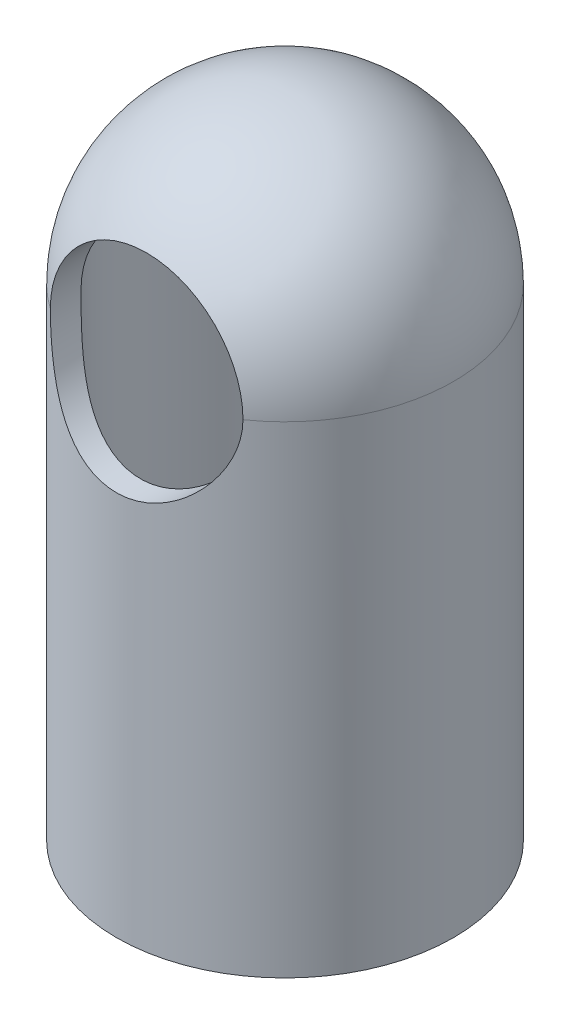
ISO-10303-21;
HEADER;
FILE_DESCRIPTION(('STEP AP214'),'2;1');
FILE_NAME('part.step','',(''),(''),'','','');
FILE_SCHEMA(('AUTOMOTIVE_DESIGN { 1 0 10303 214 1 1 1 1 }'));
ENDSEC;
DATA;
#1=APPLICATION_CONTEXT('core data for automotive mechanical design processes');
#2=APPLICATION_PROTOCOL_DEFINITION('international standard','automotive_design',2000,#1);
#3=PRODUCT_CONTEXT('',#1,'mechanical');
#4=PRODUCT('Part','Part','',(#3));
#5=PRODUCT_RELATED_PRODUCT_CATEGORY('part','',(#4));
#6=PRODUCT_DEFINITION_FORMATION('','',#4);
#7=PRODUCT_DEFINITION_CONTEXT('part definition',#1,'design');
#8=PRODUCT_DEFINITION('design','',#6,#7);
#9=PRODUCT_DEFINITION_SHAPE('','',#8);
#10=(LENGTH_UNIT() NAMED_UNIT(*) SI_UNIT(.MILLI.,.METRE.));
#11=(NAMED_UNIT(*) PLANE_ANGLE_UNIT() SI_UNIT($,.RADIAN.));
#12=(NAMED_UNIT(*) SI_UNIT($,.STERADIAN.) SOLID_ANGLE_UNIT());
#13=UNCERTAINTY_MEASURE_WITH_UNIT(LENGTH_MEASURE(1.E-05),#10,'distance_accuracy_value','');
#14=(GEOMETRIC_REPRESENTATION_CONTEXT(3) GLOBAL_UNCERTAINTY_ASSIGNED_CONTEXT((#13)) GLOBAL_UNIT_ASSIGNED_CONTEXT((#10,
#11,#12)) REPRESENTATION_CONTEXT('',''));
#15=CARTESIAN_POINT('',(0.,0.,0.));
#16=DIRECTION('',(0.,0.,1.));
#17=DIRECTION('',(1.,0.,0.));
#18=AXIS2_PLACEMENT_3D('',#15,#16,#17);
#19=CARTESIAN_POINT('',(0.,0.,0.));
#20=DIRECTION('',(0.,1.,0.));
#21=DIRECTION('',(0.,0.,1.));
#22=AXIS2_PLACEMENT_3D('',#19,#20,#21);
#23=PLANE('',#22);
#24=CARTESIAN_POINT('',(0.,0.,0.));
#25=DIRECTION('',(0.,1.,0.));
#26=DIRECTION('',(0.,0.,1.));
#27=AXIS2_PLACEMENT_3D('',#24,#25,#26);
#28=CIRCLE('',#27,7.);
#29=CARTESIAN_POINT('',(0.,0.,7.));
#30=VERTEX_POINT('',#29);
#31=EDGE_CURVE('E93',#30,#30,#28,.T.);
#32=ORIENTED_EDGE('',*,*,#31,.F.);
#33=EDGE_LOOP('',(#32));
#34=FACE_BOUND('',#33,.T.);
#35=CARTESIAN_POINT('',(0.,0.,0.));
#36=DIRECTION('',(0.,1.,0.));
#37=DIRECTION('',(0.,0.,1.));
#38=AXIS2_PLACEMENT_3D('',#35,#36,#37);
#39=CIRCLE('',#38,6.);
#40=CARTESIAN_POINT('',(0.,0.,6.));
#41=VERTEX_POINT('',#40);
#42=EDGE_CURVE('E96',#41,#41,#39,.T.);
#43=ORIENTED_EDGE('',*,*,#42,.T.);
#44=EDGE_LOOP('',(#43));
#45=FACE_BOUND('',#44,.T.);
#46=ADVANCED_FACE('F35',(#34,#45),#23,.F.);
#47=CARTESIAN_POINT('',(0.,20.,0.));
#48=DIRECTION('',(0.,-1.,0.));
#49=DIRECTION('',(0.,0.,-1.));
#50=AXIS2_PLACEMENT_3D('',#47,#48,#49);
#51=CYLINDRICAL_SURFACE('',#50,7.);
#52=CARTESIAN_POINT('',(0.,20.,0.));
#53=DIRECTION('',(0.,1.,0.));
#54=DIRECTION('',(0.,0.,1.));
#55=AXIS2_PLACEMENT_3D('',#52,#53,#54);
#56=CIRCLE('',#55,7.);
#57=CARTESIAN_POINT('',(4.,20.,5.74456264653803));
#58=VERTEX_POINT('',#57);
#59=CARTESIAN_POINT('',(4.,20.,-5.74456264653803));
#60=VERTEX_POINT('',#59);
#61=EDGE_CURVE('E81',#58,#60,#56,.T.);
#62=ORIENTED_EDGE('',*,*,#61,.F.);
#63=CARTESIAN_POINT('',(4.,20.,5.74456264653803));
#64=CARTESIAN_POINT('',(4.00002143590254,19.897732200277,5.74452371324321));
#65=CARTESIAN_POINT('',(3.99607883430024,19.7954868195837,5.74729256524473));
#66=CARTESIAN_POINT('',(3.98043539907032,19.5919605126805,5.75815051881483));
#67=CARTESIAN_POINT('',(3.96874119071113,19.4906788377149,5.76623507702226));
#68=CARTESIAN_POINT('',(3.93787689539835,19.2905550531346,5.78735271082414));
#69=CARTESIAN_POINT('',(3.91876199023617,19.1917005339171,5.80034924155758));
#70=CARTESIAN_POINT('',(3.87334321428669,18.9963677660205,5.83077695110377));
#71=CARTESIAN_POINT('',(3.84703810912316,18.8998899284607,5.84820889132903));
#72=CARTESIAN_POINT('',(3.75799949911335,18.6155356328012,5.9061377584936));
#73=CARTESIAN_POINT('',(3.68501435812009,18.4319284885035,5.95236142454356));
#74=CARTESIAN_POINT('',(3.51424668378809,18.0794269305763,6.05474648285841));
#75=CARTESIAN_POINT('',(3.41641332319505,17.9105636386466,6.11092817230876));
#76=CARTESIAN_POINT('',(3.18634104077983,17.5723487501701,6.23426588641107));
#77=CARTESIAN_POINT('',(3.05151440124681,17.4049498313098,6.30195063162779));
#78=CARTESIAN_POINT('',(2.75652655885665,17.0935358150688,6.43644252342177));
#79=CARTESIAN_POINT('',(2.59635693986737,16.949528518106,6.50324937044787));
#80=CARTESIAN_POINT('',(2.33095531633805,16.7472134305955,6.60126681147926));
#81=CARTESIAN_POINT('',(2.23359942046428,16.67958311627,6.63492225042094));
#82=CARTESIAN_POINT('',(2.03256441910529,16.5528585275083,6.69923861969471));
#83=CARTESIAN_POINT('',(1.92888792190011,16.4937607654611,6.72990077183917));
#84=CARTESIAN_POINT('',(1.71584290166404,16.3847269493589,6.78734514736684));
#85=CARTESIAN_POINT('',(1.60647639402014,16.3347876793694,6.81412873198171));
#86=CARTESIAN_POINT('',(1.38278246406313,16.2446778734712,6.86301758887103));
#87=CARTESIAN_POINT('',(1.26845576883075,16.2045059115011,6.88512354403466));
#88=CARTESIAN_POINT('',(1.04606986327153,16.1376167106984,6.92223243110546));
#89=CARTESIAN_POINT('',(0.938349533807765,16.1100242221706,6.93769041049514));
#90=CARTESIAN_POINT('',(0.7204198157706,16.0638346951501,6.96369384599118));
#91=CARTESIAN_POINT('',(0.61021076097922,16.0452364577815,6.9742399568111));
#92=CARTESIAN_POINT('',(0.388320693428234,16.0173247270642,6.99010517480307));
#93=CARTESIAN_POINT('',(0.276640679659708,16.0080052314049,6.99542766104549));
#94=CARTESIAN_POINT('',(0.0527714685452334,15.9987796684734,7.00069636087085));
#95=CARTESIAN_POINT('',(-0.059417683003819,15.9988727706869,7.0006430487838));
#96=CARTESIAN_POINT('',(-0.270589474646629,16.0079266089658,6.99547269262703));
#97=CARTESIAN_POINT('',(-0.369630447451257,16.0158830466469,6.99092914027604));
#98=CARTESIAN_POINT('',(-0.566586012851839,16.0390871390895,6.97773216829633));
#99=CARTESIAN_POINT('',(-0.664500250339928,16.054337031349,6.96907748745436));
#100=CARTESIAN_POINT('',(-0.955449815000496,16.1107789610632,6.93722016463608));
#101=CARTESIAN_POINT('',(-1.14589127671674,16.1626722276995,6.90811880150433));
#102=CARTESIAN_POINT('',(-1.51638780414823,16.2933053214238,6.83641738345729));
#103=CARTESIAN_POINT('',(-1.69633548283326,16.3722797150471,6.79369962418914));
#104=CARTESIAN_POINT('',(-2.04074945418248,16.5542348510182,6.69830527485675));
#105=CARTESIAN_POINT('',(-2.20521128051856,16.6572224895181,6.64562582480526));
#106=CARTESIAN_POINT('',(-2.53384689586634,16.8974845219963,6.52789591066468));
#107=CARTESIAN_POINT('',(-2.69588997090702,17.0373177267425,6.46212020897608));
#108=CARTESIAN_POINT('',(-2.99555014726321,17.3406266277525,6.32879490807701));
#109=CARTESIAN_POINT('',(-3.13313285033829,17.5041350412739,6.2612429617266));
#110=CARTESIAN_POINT('',(-3.39383812384776,17.8699503335383,6.12418573330372));
#111=CARTESIAN_POINT('',(-3.51412617382316,18.0745037996522,6.05516413093845));
#112=CARTESIAN_POINT('',(-3.66674662464546,18.3971510593597,5.96309578300387));
#113=CARTESIAN_POINT('',(-3.7129591822289,18.5072427637837,5.9343352864508));
#114=CARTESIAN_POINT('',(-3.79563645475019,18.7321428825232,5.88179739601785));
#115=CARTESIAN_POINT('',(-3.83210905533661,18.8469473938416,5.8580159743775));
#116=CARTESIAN_POINT('',(-3.8857871330553,19.0470463968295,5.82248889944102));
#117=CARTESIAN_POINT('',(-3.90552048657384,19.131408334055,5.80924546050745));
#118=CARTESIAN_POINT('',(-3.93952792489834,19.3016789613319,5.78623708358001));
#119=CARTESIAN_POINT('',(-3.95380364114448,19.3875871811033,5.77647110613575));
#120=CARTESIAN_POINT('',(-3.97679410218096,19.5609283657117,5.76066976834655));
#121=CARTESIAN_POINT('',(-3.98548067104949,19.6483668082221,5.75465331474837));
#122=CARTESIAN_POINT('',(-3.997091736976,19.8238663960615,5.74658739005435));
#123=CARTESIAN_POINT('',(-4.00001226335925,19.911927928618,5.7445406526446));
#124=CARTESIAN_POINT('',(-4.,20.,5.74456264653803));
#125=B_SPLINE_CURVE_WITH_KNOTS('',3,(#63,#64,#65,#66,#67,#68,#69,#70,#71,#72,#73,#74,#75,#76,
#77,#78,#79,#80,#81,#82,#83,#84,#85,#86,#87,#88,#89,#90,#91,#92,#93,#94,#95,#96,#97,#98,#99,
#100,#101,#102,#103,#104,#105,#106,#107,#108,#109,#110,#111,#112,#113,#114,#115,#116,#117,#118,
#119,#120,#121,#122,#123,#124),.UNSPECIFIED.,.F.,.F.,(4,2,2,2,2,2,2,2,2,2,2,2,2,2,2,2,2,2,2,2,2,
2,2,2,2,2,2,2,2,2,4),(0.,0.306653533608683,0.613045308991164,0.917201037738486,1.22140901519331,
1.82738029090113,2.43460121179019,3.10800316325697,3.78162921548551,4.15089165316097,
4.52000272792203,4.88898394294325,5.25791125301275,5.59423825736667,5.93052041912943,
6.26658490224298,6.60261973295557,6.9006422924811,7.19875633856325,7.79439337568317,
8.39532566849473,8.9964307507723,9.66543105511251,10.335364847948,11.0724941913154,
11.440475677126,11.8081583288605,12.0708683931415,12.3334998645284,12.5974451458091,
12.8615721246433),.UNSPECIFIED.);
#126=CARTESIAN_POINT('',(-4.,20.,5.74456264653803));
#127=VERTEX_POINT('',#126);
#128=EDGE_CURVE('E86',#58,#127,#125,.T.);
#129=ORIENTED_EDGE('',*,*,#128,.T.);
#130=CARTESIAN_POINT('',(-4.,20.,-5.74456264653803));
#131=VERTEX_POINT('',#130);
#132=EDGE_CURVE('E83',#131,#127,#56,.T.);
#133=ORIENTED_EDGE('',*,*,#132,.F.);
#134=CARTESIAN_POINT('',(-4.,20.,-5.74456264653803));
#135=CARTESIAN_POINT('',(-4.00002143590254,19.897732200277,-5.74452371324321));
#136=CARTESIAN_POINT('',(-3.99607883430024,19.7954868195837,-5.74729256524473));
#137=CARTESIAN_POINT('',(-3.98043539907032,19.5919605126805,-5.75815051881483));
#138=CARTESIAN_POINT('',(-3.96874119071113,19.4906788377149,-5.76623507702226));
#139=CARTESIAN_POINT('',(-3.93787689539835,19.2905550531346,-5.78735271082414));
#140=CARTESIAN_POINT('',(-3.91876199023617,19.1917005339171,-5.80034924155758));
#141=CARTESIAN_POINT('',(-3.87334321428669,18.9963677660205,-5.83077695110377));
#142=CARTESIAN_POINT('',(-3.84703810912316,18.8998899284607,-5.84820889132903));
#143=CARTESIAN_POINT('',(-3.75799949911335,18.6155356328012,-5.9061377584936));
#144=CARTESIAN_POINT('',(-3.68501435812009,18.4319284885035,-5.95236142454356));
#145=CARTESIAN_POINT('',(-3.51424668378809,18.0794269305763,-6.05474648285841));
#146=CARTESIAN_POINT('',(-3.41641332319505,17.9105636386466,-6.11092817230876));
#147=CARTESIAN_POINT('',(-3.18634104077983,17.5723487501701,-6.23426588641107));
#148=CARTESIAN_POINT('',(-3.05151440124681,17.4049498313098,-6.30195063162779));
#149=CARTESIAN_POINT('',(-2.75652655885665,17.0935358150688,-6.43644252342177));
#150=CARTESIAN_POINT('',(-2.59635693986737,16.949528518106,-6.50324937044787));
#151=CARTESIAN_POINT('',(-2.33095531633805,16.7472134305955,-6.60126681147926));
#152=CARTESIAN_POINT('',(-2.23359942046428,16.67958311627,-6.63492225042094));
#153=CARTESIAN_POINT('',(-2.03256441910529,16.5528585275083,-6.69923861969471));
#154=CARTESIAN_POINT('',(-1.92888792190011,16.4937607654611,-6.72990077183917));
#155=CARTESIAN_POINT('',(-1.71584290166404,16.3847269493589,-6.78734514736684));
#156=CARTESIAN_POINT('',(-1.60647639402014,16.3347876793694,-6.81412873198171));
#157=CARTESIAN_POINT('',(-1.38278246406313,16.2446778734712,-6.86301758887103));
#158=CARTESIAN_POINT('',(-1.26845576883075,16.2045059115011,-6.88512354403466));
#159=CARTESIAN_POINT('',(-1.04606986327153,16.1376167106984,-6.92223243110546));
#160=CARTESIAN_POINT('',(-0.938349533807765,16.1100242221706,-6.93769041049514));
#161=CARTESIAN_POINT('',(-0.7204198157706,16.0638346951501,-6.96369384599118));
#162=CARTESIAN_POINT('',(-0.61021076097922,16.0452364577815,-6.9742399568111));
#163=CARTESIAN_POINT('',(-0.388320693428234,16.0173247270642,-6.99010517480307));
#164=CARTESIAN_POINT('',(-0.276640679659708,16.0080052314049,-6.99542766104549));
#165=CARTESIAN_POINT('',(-0.0527714685452334,15.9987796684734,-7.00069636087085));
#166=CARTESIAN_POINT('',(0.059417683003819,15.9988727706869,-7.0006430487838));
#167=CARTESIAN_POINT('',(0.270589474646629,16.0079266089658,-6.99547269262703));
#168=CARTESIAN_POINT('',(0.369630447451257,16.0158830466469,-6.99092914027604));
#169=CARTESIAN_POINT('',(0.566586012851839,16.0390871390895,-6.97773216829633));
#170=CARTESIAN_POINT('',(0.664500250339928,16.054337031349,-6.96907748745436));
#171=CARTESIAN_POINT('',(0.955449815000496,16.1107789610632,-6.93722016463608));
#172=CARTESIAN_POINT('',(1.14589127671674,16.1626722276995,-6.90811880150433));
#173=CARTESIAN_POINT('',(1.51638780414823,16.2933053214238,-6.83641738345729));
#174=CARTESIAN_POINT('',(1.69633548283326,16.3722797150471,-6.79369962418914));
#175=CARTESIAN_POINT('',(2.04074945418248,16.5542348510182,-6.69830527485675));
#176=CARTESIAN_POINT('',(2.20521128051856,16.6572224895181,-6.64562582480526));
#177=CARTESIAN_POINT('',(2.53384689586634,16.8974845219963,-6.52789591066468));
#178=CARTESIAN_POINT('',(2.69588997090702,17.0373177267425,-6.46212020897608));
#179=CARTESIAN_POINT('',(2.99555014726321,17.3406266277525,-6.32879490807701));
#180=CARTESIAN_POINT('',(3.13313285033829,17.5041350412739,-6.2612429617266));
#181=CARTESIAN_POINT('',(3.39383812384776,17.8699503335383,-6.12418573330372));
#182=CARTESIAN_POINT('',(3.51412617382316,18.0745037996522,-6.05516413093845));
#183=CARTESIAN_POINT('',(3.66674662464546,18.3971510593597,-5.96309578300387));
#184=CARTESIAN_POINT('',(3.7129591822289,18.5072427637837,-5.9343352864508));
#185=CARTESIAN_POINT('',(3.79563645475019,18.7321428825232,-5.88179739601785));
#186=CARTESIAN_POINT('',(3.83210905533661,18.8469473938416,-5.8580159743775));
#187=CARTESIAN_POINT('',(3.8857871330553,19.0470463968295,-5.82248889944102));
#188=CARTESIAN_POINT('',(3.90552048657384,19.131408334055,-5.80924546050745));
#189=CARTESIAN_POINT('',(3.93952792489834,19.3016789613319,-5.78623708358001));
#190=CARTESIAN_POINT('',(3.95380364114448,19.3875871811033,-5.77647110613575));
#191=CARTESIAN_POINT('',(3.97679410218096,19.5609283657117,-5.76066976834655));
#192=CARTESIAN_POINT('',(3.98548067104949,19.6483668082221,-5.75465331474837));
#193=CARTESIAN_POINT('',(3.997091736976,19.8238663960615,-5.74658739005435));
#194=CARTESIAN_POINT('',(4.00001226335925,19.911927928618,-5.7445406526446));
#195=CARTESIAN_POINT('',(4.,20.,-5.74456264653803));
#196=B_SPLINE_CURVE_WITH_KNOTS('',3,(#134,#135,#136,#137,#138,#139,#140,#141,#142,#143,#144,
#145,#146,#147,#148,#149,#150,#151,#152,#153,#154,#155,#156,#157,#158,#159,#160,#161,#162,#163,
#164,#165,#166,#167,#168,#169,#170,#171,#172,#173,#174,#175,#176,#177,#178,#179,#180,#181,#182,
#183,#184,#185,#186,#187,#188,#189,#190,#191,#192,#193,#194,#195),.UNSPECIFIED.,.F.,.F.,(4,2,2,
2,2,2,2,2,2,2,2,2,2,2,2,2,2,2,2,2,2,2,2,2,2,2,2,2,2,2,4),(0.,0.306653533608683,
0.613045308991164,0.917201037738486,1.22140901519331,1.82738029090113,2.43460121179019,
3.10800316325697,3.78162921548551,4.15089165316097,4.52000272792203,4.88898394294325,
5.25791125301275,5.59423825736667,5.93052041912943,6.26658490224298,6.60261973295557,
6.9006422924811,7.19875633856325,7.79439337568317,8.39532566849473,8.9964307507723,
9.66543105511251,10.335364847948,11.0724941913154,11.440475677126,11.8081583288605,
12.0708683931415,12.3334998645284,12.5974451458091,12.8615721246433),.UNSPECIFIED.);
#197=EDGE_CURVE('E77',#131,#60,#196,.T.);
#198=ORIENTED_EDGE('',*,*,#197,.T.);
#199=EDGE_LOOP('',(#62,#129,#133,#198));
#200=FACE_BOUND('',#199,.T.);
#201=ORIENTED_EDGE('',*,*,#31,.T.);
#202=EDGE_LOOP('',(#201));
#203=FACE_BOUND('',#202,.T.);
#204=ADVANCED_FACE('F37',(#200,#203),#51,.T.);
#205=CARTESIAN_POINT('',(0.,20.,0.));
#206=DIRECTION('',(0.,-1.,0.));
#207=DIRECTION('',(0.,0.,-1.));
#208=AXIS2_PLACEMENT_3D('',#205,#206,#207);
#209=CYLINDRICAL_SURFACE('',#208,6.);
#210=CARTESIAN_POINT('',(4.,20.,4.47213595499958));
#211=CARTESIAN_POINT('',(4.00002564808486,19.9016700694421,4.47208179485814));
#212=CARTESIAN_POINT('',(3.99637537002524,19.803373809837,4.47537753595784));
#213=CARTESIAN_POINT('',(3.98192913301381,19.6078499824939,4.48825214514583));
#214=CARTESIAN_POINT('',(3.97114274986204,19.5106211598811,4.49782259317285));
#215=CARTESIAN_POINT('',(3.94277016031305,19.3189160856903,4.52270859645528));
#216=CARTESIAN_POINT('',(3.92525210363882,19.2244221397863,4.53796652813263));
#217=CARTESIAN_POINT('',(3.88373572206669,19.0378468270955,4.57354866865432));
#218=CARTESIAN_POINT('',(3.85973551226047,18.9457661706127,4.59387435098863));
#219=CARTESIAN_POINT('',(3.77881549936075,18.6748967950068,4.66105656140231));
#220=CARTESIAN_POINT('',(3.7127988621957,18.5003249059518,4.71428471273184));
#221=CARTESIAN_POINT('',(3.55890532237869,18.164660993962,4.83151636315002));
#222=CARTESIAN_POINT('',(3.47096630412232,18.003609042524,4.89555031026237));
#223=CARTESIAN_POINT('',(3.26002518912108,17.6726721668229,5.0389394398168));
#224=CARTESIAN_POINT('',(3.13370534900656,17.5052649498398,5.11913345927512));
#225=CARTESIAN_POINT('',(2.85627006529231,17.1918872762063,5.27895263984956));
#226=CARTESIAN_POINT('',(2.70514445110618,17.0459256591567,5.3585775535945));
#227=CARTESIAN_POINT('',(2.44938412738464,16.8353387691972,5.47824189391531));
#228=CARTESIAN_POINT('',(2.35244625950904,16.7625927007597,5.52066849991472));
#229=CARTESIAN_POINT('',(2.15138142891237,16.6256347561315,5.60208008882511));
#230=CARTESIAN_POINT('',(2.04725754358477,16.5614192607838,5.6410665288789));
#231=CARTESIAN_POINT('',(1.83236861535899,16.4422602153108,5.71448281366289));
#232=CARTESIAN_POINT('',(1.72160673091249,16.387312302275,5.74891480084181));
#233=CARTESIAN_POINT('',(1.49411929166919,16.2874500802822,5.81218835381697));
#234=CARTESIAN_POINT('',(1.37739502161335,16.2425336209168,5.84103111758017));
#235=CARTESIAN_POINT('',(1.15232438617355,16.1679527379798,5.88930158956778));
#236=CARTESIAN_POINT('',(1.04450577673409,16.1371429666341,5.9094222944176));
#237=CARTESIAN_POINT('',(0.825797525005126,16.084556090231,5.94393020867914));
#238=CARTESIAN_POINT('',(0.714908488854786,16.0627772157379,5.95831854122053));
#239=CARTESIAN_POINT('',(0.491175659166559,16.0286602692173,5.98091766028753));
#240=CARTESIAN_POINT('',(0.378333914393883,16.0163128510814,5.98913456226123));
#241=CARTESIAN_POINT('',(0.151731032293564,16.0012670175454,5.99915268630153));
#242=CARTESIAN_POINT('',(0.0379700269577492,15.9985672407247,6.00095481358471));
#243=CARTESIAN_POINT('',(-0.171941077591328,16.0025359831951,5.99830969280874));
#244=CARTESIAN_POINT('',(-0.268132229773421,16.0078391464272,5.99477321529853));
#245=CARTESIAN_POINT('',(-0.459637379767192,16.0253326644031,5.98313776264735));
#246=CARTESIAN_POINT('',(-0.554951112576705,16.0375250347069,5.97503745227804));
#247=CARTESIAN_POINT('',(-0.743961654908527,16.0686276380302,5.95445648617724));
#248=CARTESIAN_POINT('',(-0.837659003468094,16.0875355842599,5.94197732155185));
#249=CARTESIAN_POINT('',(-1.02287487763531,16.1318208891128,5.91291254262685));
#250=CARTESIAN_POINT('',(-1.11439254323105,16.1572007565209,5.89632533595177));
#251=CARTESIAN_POINT('',(-1.3840442887299,16.2423705436646,5.84105189440648));
#252=CARTESIAN_POINT('',(-1.55823030603855,16.3113512975243,5.7967449528693));
#253=CARTESIAN_POINT('',(-1.89244917936027,16.4711137268256,5.69641871643415));
#254=CARTESIAN_POINT('',(-2.05247944163046,16.5618993862802,5.64039728140257));
#255=CARTESIAN_POINT('',(-2.37655742804542,16.7759534369368,5.51236412832813));
#256=CARTESIAN_POINT('',(-2.53836908169484,16.901922758987,5.43921852136052));
#257=CARTESIAN_POINT('',(-2.83999875122257,17.1758175657317,5.28799731240595));
#258=CARTESIAN_POINT('',(-2.97978279055417,17.3237762981113,5.20991434974111));
#259=CARTESIAN_POINT('',(-3.18155899492951,17.5727700828312,5.08774656483247));
#260=CARTESIAN_POINT('',(-3.25148608314705,17.6672579482261,5.04321981150981));
#261=CARTESIAN_POINT('',(-3.38308853001505,17.8625720649592,4.95590113526926));
#262=CARTESIAN_POINT('',(-3.44476195893437,17.9633997905052,4.91310961967965));
#263=CARTESIAN_POINT('',(-3.61659442464906,18.2747973576292,4.78957625888523));
#264=CARTESIAN_POINT('',(-3.71392334582887,18.4947201963963,4.71344808061069));
#265=CARTESIAN_POINT('',(-3.84707933764019,18.8907212733341,4.60491730473039));
#266=CARTESIAN_POINT('',(-3.89249592340257,19.0618387549338,4.56624005889123));
#267=CARTESIAN_POINT('',(-3.94344902129006,19.3238865733191,4.52213305410513));
#268=CARTESIAN_POINT('',(-3.95756560629594,19.4120361908501,4.50975456213345));
#269=CARTESIAN_POINT('',(-3.97989658277399,19.5896181690323,4.4900617689767));
#270=CARTESIAN_POINT('',(-3.98811466252988,19.6790496923692,4.48274430328052));
#271=CARTESIAN_POINT('',(-3.99553896598661,19.8072383792669,4.47612270458759));
#272=CARTESIAN_POINT('',(-3.99721146054976,19.8457629168698,4.4746288149854));
#273=CARTESIAN_POINT('',(-3.99944177812552,19.9228564849096,4.47263540521944));
#274=CARTESIAN_POINT('',(-3.99999998871195,19.9614254952058,4.47213553931138));
#275=CARTESIAN_POINT('',(-4.,20.,4.47213595499958));
#276=B_SPLINE_CURVE_WITH_KNOTS('',3,(#210,#211,#212,#213,#214,#215,#216,#217,#218,#219,#220,
#221,#222,#223,#224,#225,#226,#227,#228,#229,#230,#231,#232,#233,#234,#235,#236,#237,#238,#239,
#240,#241,#242,#243,#244,#245,#246,#247,#248,#249,#250,#251,#252,#253,#254,#255,#256,#257,#258,
#259,#260,#261,#262,#263,#264,#265,#266,#267,#268,#269,#270,#271,#272,#273,#274,#275),
.UNSPECIFIED.,.F.,.F.,(4,2,2,2,2,2,2,2,2,2,2,2,2,2,2,2,2,2,2,2,2,2,2,2,2,2,2,2,2,2,2,2,4),(0.,
0.294812601374013,0.589230399700311,0.88074293705704,1.17234033311452,1.75203722892106,
2.33339570715297,3.00454638680602,3.67597293470638,4.06075015246325,4.44536360079123,
4.82979547572238,5.21414486203718,5.55540621902153,5.89660068058383,6.23745659503621,
6.57826440792966,6.86711986515746,7.15605987596875,7.4449015910287,7.73385544376987,
8.30887925814425,8.88400821617184,9.53472255750196,10.1864309725428,10.563119297333,
10.9398955397299,11.6916405518195,12.2329415710687,12.5030281277052,12.7729456541035,
12.8886912839471,13.0043966477551),.UNSPECIFIED.);
#277=CARTESIAN_POINT('',(4.,20.,4.47213595499958));
#278=VERTEX_POINT('',#277);
#279=CARTESIAN_POINT('',(-4.,20.,4.47213595499958));
#280=VERTEX_POINT('',#279);
#281=EDGE_CURVE('E50',#278,#280,#276,.T.);
#282=ORIENTED_EDGE('',*,*,#281,.F.);
#283=CARTESIAN_POINT('',(0.,20.,0.));
#284=DIRECTION('',(0.,-1.,0.));
#285=DIRECTION('',(0.,0.,-1.));
#286=AXIS2_PLACEMENT_3D('',#283,#284,#285);
#287=CIRCLE('',#286,6.);
#288=CARTESIAN_POINT('',(4.,20.,-4.47213595499958));
#289=VERTEX_POINT('',#288);
#290=EDGE_CURVE('E101',#289,#278,#287,.T.);
#291=ORIENTED_EDGE('',*,*,#290,.F.);
#292=CARTESIAN_POINT('',(-4.,20.,-4.47213595499958));
#293=CARTESIAN_POINT('',(-4.00002564808486,19.9016700694421,-4.47208179485814));
#294=CARTESIAN_POINT('',(-3.99637537002524,19.803373809837,-4.47537753595784));
#295=CARTESIAN_POINT('',(-3.98192913301381,19.6078499824939,-4.48825214514583));
#296=CARTESIAN_POINT('',(-3.97114274986204,19.5106211598811,-4.49782259317285));
#297=CARTESIAN_POINT('',(-3.94277016031305,19.3189160856903,-4.52270859645528));
#298=CARTESIAN_POINT('',(-3.92525210363882,19.2244221397863,-4.53796652813263));
#299=CARTESIAN_POINT('',(-3.88373572206669,19.0378468270955,-4.57354866865432));
#300=CARTESIAN_POINT('',(-3.85973551226047,18.9457661706127,-4.59387435098863));
#301=CARTESIAN_POINT('',(-3.77881549936075,18.6748967950068,-4.66105656140231));
#302=CARTESIAN_POINT('',(-3.7127988621957,18.5003249059518,-4.71428471273184));
#303=CARTESIAN_POINT('',(-3.55890532237869,18.164660993962,-4.83151636315002));
#304=CARTESIAN_POINT('',(-3.47096630412232,18.003609042524,-4.89555031026237));
#305=CARTESIAN_POINT('',(-3.26002518912108,17.6726721668229,-5.0389394398168));
#306=CARTESIAN_POINT('',(-3.13370534900656,17.5052649498398,-5.11913345927512));
#307=CARTESIAN_POINT('',(-2.85627006529231,17.1918872762063,-5.27895263984956));
#308=CARTESIAN_POINT('',(-2.70514445110618,17.0459256591567,-5.3585775535945));
#309=CARTESIAN_POINT('',(-2.44938412738464,16.8353387691972,-5.47824189391531));
#310=CARTESIAN_POINT('',(-2.35244625950904,16.7625927007597,-5.52066849991472));
#311=CARTESIAN_POINT('',(-2.15138142891237,16.6256347561315,-5.60208008882511));
#312=CARTESIAN_POINT('',(-2.04725754358477,16.5614192607838,-5.6410665288789));
#313=CARTESIAN_POINT('',(-1.83236861535899,16.4422602153108,-5.71448281366289));
#314=CARTESIAN_POINT('',(-1.72160673091249,16.387312302275,-5.74891480084181));
#315=CARTESIAN_POINT('',(-1.49411929166919,16.2874500802822,-5.81218835381697));
#316=CARTESIAN_POINT('',(-1.37739502161335,16.2425336209168,-5.84103111758017));
#317=CARTESIAN_POINT('',(-1.15232438617355,16.1679527379798,-5.88930158956778));
#318=CARTESIAN_POINT('',(-1.04450577673409,16.1371429666341,-5.9094222944176));
#319=CARTESIAN_POINT('',(-0.825797525005126,16.084556090231,-5.94393020867914));
#320=CARTESIAN_POINT('',(-0.714908488854786,16.0627772157379,-5.95831854122053));
#321=CARTESIAN_POINT('',(-0.491175659166559,16.0286602692173,-5.98091766028753));
#322=CARTESIAN_POINT('',(-0.378333914393883,16.0163128510814,-5.98913456226123));
#323=CARTESIAN_POINT('',(-0.151731032293564,16.0012670175454,-5.99915268630153));
#324=CARTESIAN_POINT('',(-0.0379700269577492,15.9985672407247,-6.00095481358471));
#325=CARTESIAN_POINT('',(0.171941077591328,16.0025359831951,-5.99830969280874));
#326=CARTESIAN_POINT('',(0.268132229773421,16.0078391464272,-5.99477321529853));
#327=CARTESIAN_POINT('',(0.459637379767192,16.0253326644031,-5.98313776264735));
#328=CARTESIAN_POINT('',(0.554951112576705,16.0375250347069,-5.97503745227804));
#329=CARTESIAN_POINT('',(0.743961654908527,16.0686276380302,-5.95445648617724));
#330=CARTESIAN_POINT('',(0.837659003468094,16.0875355842599,-5.94197732155185));
#331=CARTESIAN_POINT('',(1.02287487763531,16.1318208891128,-5.91291254262685));
#332=CARTESIAN_POINT('',(1.11439254323105,16.1572007565209,-5.89632533595177));
#333=CARTESIAN_POINT('',(1.3840442887299,16.2423705436646,-5.84105189440648));
#334=CARTESIAN_POINT('',(1.55823030603855,16.3113512975243,-5.7967449528693));
#335=CARTESIAN_POINT('',(1.89244917936027,16.4711137268256,-5.69641871643415));
#336=CARTESIAN_POINT('',(2.05247944163046,16.5618993862802,-5.64039728140257));
#337=CARTESIAN_POINT('',(2.37655742804542,16.7759534369368,-5.51236412832813));
#338=CARTESIAN_POINT('',(2.53836908169484,16.901922758987,-5.43921852136052));
#339=CARTESIAN_POINT('',(2.83999875122257,17.1758175657317,-5.28799731240595));
#340=CARTESIAN_POINT('',(2.97978279055417,17.3237762981113,-5.20991434974111));
#341=CARTESIAN_POINT('',(3.18155899492951,17.5727700828312,-5.08774656483247));
#342=CARTESIAN_POINT('',(3.25148608314705,17.6672579482261,-5.04321981150981));
#343=CARTESIAN_POINT('',(3.38308853001505,17.8625720649592,-4.95590113526926));
#344=CARTESIAN_POINT('',(3.44476195893437,17.9633997905052,-4.91310961967965));
#345=CARTESIAN_POINT('',(3.61659442464906,18.2747973576292,-4.78957625888523));
#346=CARTESIAN_POINT('',(3.71392334582887,18.4947201963963,-4.71344808061069));
#347=CARTESIAN_POINT('',(3.84707933764019,18.8907212733341,-4.60491730473039));
#348=CARTESIAN_POINT('',(3.89249592340257,19.0618387549338,-4.56624005889123));
#349=CARTESIAN_POINT('',(3.94344902129006,19.3238865733191,-4.52213305410513));
#350=CARTESIAN_POINT('',(3.95756560629594,19.4120361908501,-4.50975456213345));
#351=CARTESIAN_POINT('',(3.97989658277399,19.5896181690323,-4.4900617689767));
#352=CARTESIAN_POINT('',(3.98811466252988,19.6790496923692,-4.48274430328052));
#353=CARTESIAN_POINT('',(3.99553896598661,19.8072383792669,-4.47612270458759));
#354=CARTESIAN_POINT('',(3.99721146054976,19.8457629168698,-4.4746288149854));
#355=CARTESIAN_POINT('',(3.99944177812552,19.9228564849096,-4.47263540521944));
#356=CARTESIAN_POINT('',(3.99999998871195,19.9614254952058,-4.47213553931138));
#357=CARTESIAN_POINT('',(4.,20.,-4.47213595499958));
#358=B_SPLINE_CURVE_WITH_KNOTS('',3,(#292,#293,#294,#295,#296,#297,#298,#299,#300,#301,#302,
#303,#304,#305,#306,#307,#308,#309,#310,#311,#312,#313,#314,#315,#316,#317,#318,#319,#320,#321,
#322,#323,#324,#325,#326,#327,#328,#329,#330,#331,#332,#333,#334,#335,#336,#337,#338,#339,#340,
#341,#342,#343,#344,#345,#346,#347,#348,#349,#350,#351,#352,#353,#354,#355,#356,#357),
.UNSPECIFIED.,.F.,.F.,(4,2,2,2,2,2,2,2,2,2,2,2,2,2,2,2,2,2,2,2,2,2,2,2,2,2,2,2,2,2,2,2,4),(0.,
0.294812601374013,0.589230399700311,0.88074293705704,1.17234033311452,1.75203722892106,
2.33339570715297,3.00454638680602,3.67597293470638,4.06075015246325,4.44536360079123,
4.82979547572238,5.21414486203718,5.55540621902153,5.89660068058383,6.23745659503621,
6.57826440792966,6.86711986515746,7.15605987596875,7.4449015910287,7.73385544376987,
8.30887925814425,8.88400821617184,9.53472255750196,10.1864309725428,10.563119297333,
10.9398955397299,11.6916405518195,12.2329415710687,12.5030281277052,12.7729456541035,
12.8886912839471,13.0043966477551),.UNSPECIFIED.);
#359=CARTESIAN_POINT('',(-4.,20.,-4.47213595499958));
#360=VERTEX_POINT('',#359);
#361=EDGE_CURVE('E57',#360,#289,#358,.T.);
#362=ORIENTED_EDGE('',*,*,#361,.F.);
#363=EDGE_CURVE('E105',#280,#360,#287,.T.);
#364=ORIENTED_EDGE('',*,*,#363,.F.);
#365=EDGE_LOOP('',(#282,#291,#362,#364));
#366=FACE_BOUND('',#365,.T.);
#367=ORIENTED_EDGE('',*,*,#42,.F.);
#368=EDGE_LOOP('',(#367));
#369=FACE_BOUND('',#368,.T.);
#370=ADVANCED_FACE('F118',(#366,#369),#209,.F.);
#371=CARTESIAN_POINT('',(0.,20.,0.));
#372=DIRECTION('',(0.,-1.,0.));
#373=DIRECTION('',(-1.,0.,0.));
#374=AXIS2_PLACEMENT_3D('',#371,#372,#373);
#375=SPHERICAL_SURFACE('',#374,6.);
#376=ORIENTED_EDGE('',*,*,#290,.T.);
#377=CARTESIAN_POINT('',(0.,20.,4.47213595499958));
#378=DIRECTION('',(0.,0.,-1.));
#379=DIRECTION('',(-1.,0.,0.));
#380=AXIS2_PLACEMENT_3D('',#377,#378,#379);
#381=CIRCLE('',#380,4.);
#382=EDGE_CURVE('E116',#278,#280,#381,.F.);
#383=ORIENTED_EDGE('',*,*,#382,.T.);
#384=ORIENTED_EDGE('',*,*,#363,.T.);
#385=CARTESIAN_POINT('',(0.,20.,-4.47213595499958));
#386=DIRECTION('',(0.,0.,1.));
#387=DIRECTION('',(1.,0.,0.));
#388=AXIS2_PLACEMENT_3D('',#385,#386,#387);
#389=CIRCLE('',#388,4.);
#390=EDGE_CURVE('E140',#360,#289,#389,.F.);
#391=ORIENTED_EDGE('',*,*,#390,.T.);
#392=EDGE_LOOP('',(#376,#383,#384,#391));
#393=FACE_BOUND('',#392,.T.);
#394=ADVANCED_FACE('F125',(#393),#375,.F.);
#395=CARTESIAN_POINT('',(0.,20.,0.));
#396=DIRECTION('',(0.,-1.,0.));
#397=DIRECTION('',(-1.,0.,0.));
#398=AXIS2_PLACEMENT_3D('',#395,#396,#397);
#399=SPHERICAL_SURFACE('',#398,7.);
#400=ORIENTED_EDGE('',*,*,#132,.T.);
#401=CARTESIAN_POINT('',(0.,20.,5.74456264653803));
#402=DIRECTION('',(0.,0.,-1.));
#403=DIRECTION('',(-1.,0.,0.));
#404=AXIS2_PLACEMENT_3D('',#401,#402,#403);
#405=CIRCLE('',#404,4.);
#406=EDGE_CURVE('E11',#127,#58,#405,.T.);
#407=ORIENTED_EDGE('',*,*,#406,.T.);
#408=ORIENTED_EDGE('',*,*,#61,.T.);
#409=CARTESIAN_POINT('',(0.,20.,-5.74456264653803));
#410=DIRECTION('',(0.,0.,1.));
#411=DIRECTION('',(1.,0.,0.));
#412=AXIS2_PLACEMENT_3D('',#409,#410,#411);
#413=CIRCLE('',#412,4.);
#414=EDGE_CURVE('E44',#60,#131,#413,.T.);
#415=ORIENTED_EDGE('',*,*,#414,.T.);
#416=EDGE_LOOP('',(#400,#407,#408,#415));
#417=FACE_BOUND('',#416,.T.);
#418=ADVANCED_FACE('F90',(#417),#399,.T.);
#419=CARTESIAN_POINT('',(0.,20.,-7.));
#420=DIRECTION('',(0.,0.,1.));
#421=DIRECTION('',(1.,0.,0.));
#422=AXIS2_PLACEMENT_3D('',#419,#420,#421);
#423=CYLINDRICAL_SURFACE('',#422,4.);
#424=ORIENTED_EDGE('',*,*,#361,.T.);
#425=ORIENTED_EDGE('',*,*,#390,.F.);
#426=EDGE_LOOP('',(#424,#425));
#427=FACE_BOUND('',#426,.T.);
#428=ORIENTED_EDGE('',*,*,#414,.F.);
#429=ORIENTED_EDGE('',*,*,#197,.F.);
#430=EDGE_LOOP('',(#428,#429));
#431=FACE_BOUND('',#430,.T.);
#432=ADVANCED_FACE('F88',(#427,#431),#423,.F.);
#433=ORIENTED_EDGE('',*,*,#281,.T.);
#434=ORIENTED_EDGE('',*,*,#382,.F.);
#435=EDGE_LOOP('',(#433,#434));
#436=FACE_BOUND('',#435,.T.);
#437=ORIENTED_EDGE('',*,*,#406,.F.);
#438=ORIENTED_EDGE('',*,*,#128,.F.);
#439=EDGE_LOOP('',(#437,#438));
#440=FACE_BOUND('',#439,.T.);
#441=ADVANCED_FACE('F121',(#436,#440),#423,.F.);
#442=CLOSED_SHELL('',(#46,#204,#370,#394,#418,#432,#441));
#443=MANIFOLD_SOLID_BREP('B2',#442);
#444=ADVANCED_BREP_SHAPE_REPRESENTATION('',(#18,#443),#14);
#445=SHAPE_DEFINITION_REPRESENTATION(#9,#444);
ENDSEC;
END-ISO-10303-21;
